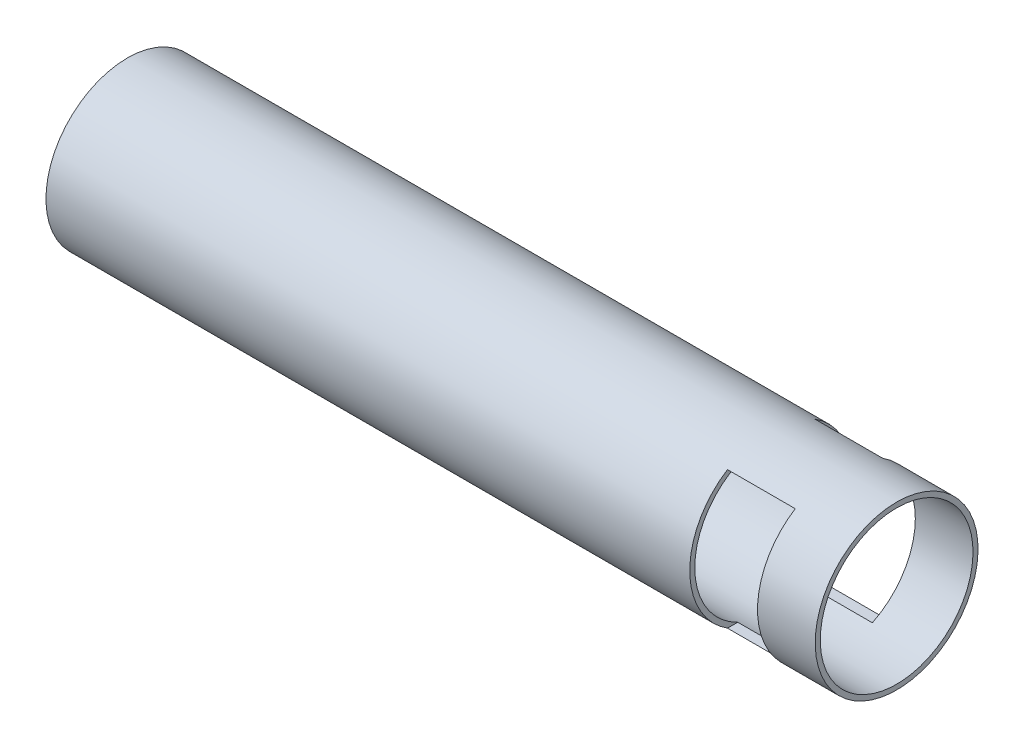
ISO-10303-21;
HEADER;
FILE_DESCRIPTION(('STEP AP214'),'2;1');
FILE_NAME('part.step','',(''),(''),'','','');
FILE_SCHEMA(('AUTOMOTIVE_DESIGN { 1 0 10303 214 1 1 1 1 }'));
ENDSEC;
DATA;
#1=APPLICATION_CONTEXT('core data for automotive mechanical design processes');
#2=APPLICATION_PROTOCOL_DEFINITION('international standard','automotive_design',2000,#1);
#3=PRODUCT_CONTEXT('',#1,'mechanical');
#4=PRODUCT('Part','Part','',(#3));
#5=PRODUCT_RELATED_PRODUCT_CATEGORY('part','',(#4));
#6=PRODUCT_DEFINITION_FORMATION('','',#4);
#7=PRODUCT_DEFINITION_CONTEXT('part definition',#1,'design');
#8=PRODUCT_DEFINITION('design','',#6,#7);
#9=PRODUCT_DEFINITION_SHAPE('','',#8);
#10=(LENGTH_UNIT() NAMED_UNIT(*) SI_UNIT(.MILLI.,.METRE.));
#11=(NAMED_UNIT(*) PLANE_ANGLE_UNIT() SI_UNIT($,.RADIAN.));
#12=(NAMED_UNIT(*) SI_UNIT($,.STERADIAN.) SOLID_ANGLE_UNIT());
#13=UNCERTAINTY_MEASURE_WITH_UNIT(LENGTH_MEASURE(1.E-05),#10,'distance_accuracy_value','');
#14=(GEOMETRIC_REPRESENTATION_CONTEXT(3) GLOBAL_UNCERTAINTY_ASSIGNED_CONTEXT((#13)) GLOBAL_UNIT_ASSIGNED_CONTEXT((#10,
#11,#12)) REPRESENTATION_CONTEXT('',''));
#15=CARTESIAN_POINT('',(0.,0.,0.));
#16=DIRECTION('',(0.,0.,1.));
#17=DIRECTION('',(1.,0.,0.));
#18=AXIS2_PLACEMENT_3D('',#15,#16,#17);
#19=CARTESIAN_POINT('',(210.,0.,0.));
#20=DIRECTION('',(-1.,0.,0.));
#21=DIRECTION('',(0.,-1.,0.));
#22=AXIS2_PLACEMENT_3D('',#19,#20,#21);
#23=CYLINDRICAL_SURFACE('',#22,41.7068);
#24=CARTESIAN_POINT('',(210.,0.,0.));
#25=DIRECTION('',(1.,0.,0.));
#26=DIRECTION('',(0.,1.,0.));
#27=AXIS2_PLACEMENT_3D('',#24,#25,#26);
#28=CIRCLE('',#27,41.7068);
#29=CARTESIAN_POINT('',(210.,41.7068000000001,0.));
#30=VERTEX_POINT('',#29);
#31=EDGE_CURVE('E150',#30,#30,#28,.T.);
#32=ORIENTED_EDGE('',*,*,#31,.T.);
#33=EDGE_LOOP('',(#32));
#34=FACE_BOUND('',#33,.T.);
#35=CARTESIAN_POINT('',(-210.,0.,0.));
#36=DIRECTION('',(1.,0.,0.));
#37=DIRECTION('',(0.,1.,0.));
#38=AXIS2_PLACEMENT_3D('',#35,#36,#37);
#39=CIRCLE('',#38,41.7068);
#40=CARTESIAN_POINT('',(-210.,41.7067999999999,0.));
#41=VERTEX_POINT('',#40);
#42=EDGE_CURVE('E158',#41,#41,#39,.T.);
#43=ORIENTED_EDGE('',*,*,#42,.F.);
#44=EDGE_LOOP('',(#43));
#45=FACE_BOUND('',#44,.T.);
#46=DIRECTION('',(-1.,0.,0.));
#47=VECTOR('',#46,1.);
#48=CARTESIAN_POINT('',(210.,-37.4999999999999,18.2539630283399));
#49=LINE('',#48,#47);
#50=CARTESIAN_POINT('',(141.5,-37.4999999999999,18.25396302834));
#51=VERTEX_POINT('',#50);
#52=CARTESIAN_POINT('',(178.5,-37.4999999999999,18.2539630283399));
#53=VERTEX_POINT('',#52);
#54=EDGE_CURVE('E114',#51,#53,#49,.F.);
#55=ORIENTED_EDGE('',*,*,#54,.T.);
#56=CARTESIAN_POINT('',(178.5,0.,0.));
#57=DIRECTION('',(-1.,0.,0.));
#58=DIRECTION('',(0.,0.,1.));
#59=AXIS2_PLACEMENT_3D('',#56,#57,#58);
#60=CIRCLE('',#59,41.7068);
#61=CARTESIAN_POINT('',(178.5,37.5000000000001,18.2539630283399));
#62=VERTEX_POINT('',#61);
#63=EDGE_CURVE('E147',#53,#62,#60,.T.);
#64=ORIENTED_EDGE('',*,*,#63,.T.);
#65=DIRECTION('',(-1.,0.,0.));
#66=VECTOR('',#65,1.);
#67=CARTESIAN_POINT('',(210.,37.5000000000001,18.2539630283399));
#68=LINE('',#67,#66);
#69=CARTESIAN_POINT('',(141.5,37.5000000000001,18.2539630283398));
#70=VERTEX_POINT('',#69);
#71=EDGE_CURVE('E137',#62,#70,#68,.T.);
#72=ORIENTED_EDGE('',*,*,#71,.T.);
#73=CARTESIAN_POINT('',(141.5,0.,0.));
#74=DIRECTION('',(1.,0.,0.));
#75=DIRECTION('',(0.,1.,0.));
#76=AXIS2_PLACEMENT_3D('',#73,#74,#75);
#77=CIRCLE('',#76,41.7068);
#78=EDGE_CURVE('E128',#70,#51,#77,.T.);
#79=ORIENTED_EDGE('',*,*,#78,.T.);
#80=EDGE_LOOP('',(#55,#64,#72,#79));
#81=FACE_BOUND('',#80,.T.);
#82=DIRECTION('',(-1.,0.,0.));
#83=VECTOR('',#82,1.);
#84=CARTESIAN_POINT('',(210.,37.5000000000001,-18.2539630283399));
#85=LINE('',#84,#83);
#86=CARTESIAN_POINT('',(141.5,37.5000000000001,-18.2539630283398));
#87=VERTEX_POINT('',#86);
#88=CARTESIAN_POINT('',(178.5,37.5000000000001,-18.2539630283399));
#89=VERTEX_POINT('',#88);
#90=EDGE_CURVE('E138',#87,#89,#85,.F.);
#91=ORIENTED_EDGE('',*,*,#90,.T.);
#92=CARTESIAN_POINT('',(178.5,-37.4999999999999,-18.2539630283399));
#93=VERTEX_POINT('',#92);
#94=EDGE_CURVE('E149',#89,#93,#60,.T.);
#95=ORIENTED_EDGE('',*,*,#94,.T.);
#96=DIRECTION('',(-1.,0.,0.));
#97=VECTOR('',#96,1.);
#98=CARTESIAN_POINT('',(210.,-37.4999999999999,-18.2539630283399));
#99=LINE('',#98,#97);
#100=CARTESIAN_POINT('',(141.5,-37.4999999999999,-18.2539630283399));
#101=VERTEX_POINT('',#100);
#102=EDGE_CURVE('E122',#93,#101,#99,.T.);
#103=ORIENTED_EDGE('',*,*,#102,.T.);
#104=EDGE_CURVE('E139',#101,#87,#77,.T.);
#105=ORIENTED_EDGE('',*,*,#104,.T.);
#106=EDGE_LOOP('',(#91,#95,#103,#105));
#107=FACE_BOUND('',#106,.T.);
#108=ADVANCED_FACE('F50',(#34,#45,#81,#107),#23,.F.);
#109=CARTESIAN_POINT('',(210.,0.,0.));
#110=DIRECTION('',(-1.,0.,0.));
#111=DIRECTION('',(0.,-1.,0.));
#112=AXIS2_PLACEMENT_3D('',#109,#110,#111);
#113=CYLINDRICAL_SURFACE('',#112,44.45);
#114=CARTESIAN_POINT('',(178.5,0.,0.));
#115=DIRECTION('',(-1.,0.,0.));
#116=DIRECTION('',(0.,0.,1.));
#117=AXIS2_PLACEMENT_3D('',#114,#115,#116);
#118=CIRCLE('',#117,44.45);
#119=CARTESIAN_POINT('',(178.5,-37.4999999999999,23.8652990762739));
#120=VERTEX_POINT('',#119);
#121=CARTESIAN_POINT('',(178.5,37.5000000000001,23.8652990762739));
#122=VERTEX_POINT('',#121);
#123=EDGE_CURVE('E59',#120,#122,#118,.T.);
#124=ORIENTED_EDGE('',*,*,#123,.F.);
#125=DIRECTION('',(-1.,0.,0.));
#126=VECTOR('',#125,1.);
#127=CARTESIAN_POINT('',(210.,-37.4999999999999,23.8652990762739));
#128=LINE('',#127,#126);
#129=CARTESIAN_POINT('',(141.5,-37.4999999999999,23.8652990762739));
#130=VERTEX_POINT('',#129);
#131=EDGE_CURVE('E157',#130,#120,#128,.F.);
#132=ORIENTED_EDGE('',*,*,#131,.F.);
#133=CARTESIAN_POINT('',(141.5,0.,0.));
#134=DIRECTION('',(1.,0.,0.));
#135=DIRECTION('',(0.,1.,0.));
#136=AXIS2_PLACEMENT_3D('',#133,#134,#135);
#137=CIRCLE('',#136,44.45);
#138=CARTESIAN_POINT('',(141.5,37.5000000000001,23.8652990762738));
#139=VERTEX_POINT('',#138);
#140=EDGE_CURVE('E131',#139,#130,#137,.T.);
#141=ORIENTED_EDGE('',*,*,#140,.F.);
#142=DIRECTION('',(-1.,0.,0.));
#143=VECTOR('',#142,1.);
#144=CARTESIAN_POINT('',(210.,37.5000000000001,23.8652990762739));
#145=LINE('',#144,#143);
#146=EDGE_CURVE('E165',#122,#139,#145,.T.);
#147=ORIENTED_EDGE('',*,*,#146,.F.);
#148=EDGE_LOOP('',(#124,#132,#141,#147));
#149=FACE_BOUND('',#148,.T.);
#150=CARTESIAN_POINT('',(210.,0.,0.));
#151=DIRECTION('',(1.,0.,0.));
#152=DIRECTION('',(0.,1.,0.));
#153=AXIS2_PLACEMENT_3D('',#150,#151,#152);
#154=CIRCLE('',#153,44.45);
#155=CARTESIAN_POINT('',(210.,44.4500000000001,0.));
#156=VERTEX_POINT('',#155);
#157=EDGE_CURVE('E153',#156,#156,#154,.T.);
#158=ORIENTED_EDGE('',*,*,#157,.F.);
#159=EDGE_LOOP('',(#158));
#160=FACE_BOUND('',#159,.T.);
#161=CARTESIAN_POINT('',(-210.,0.,0.));
#162=DIRECTION('',(1.,0.,0.));
#163=DIRECTION('',(0.,1.,0.));
#164=AXIS2_PLACEMENT_3D('',#161,#162,#163);
#165=CIRCLE('',#164,44.45);
#166=CARTESIAN_POINT('',(-210.,44.4499999999999,0.));
#167=VERTEX_POINT('',#166);
#168=EDGE_CURVE('E154',#167,#167,#165,.T.);
#169=ORIENTED_EDGE('',*,*,#168,.T.);
#170=EDGE_LOOP('',(#169));
#171=FACE_BOUND('',#170,.T.);
#172=CARTESIAN_POINT('',(178.5,37.5000000000001,-23.8652990762739));
#173=VERTEX_POINT('',#172);
#174=CARTESIAN_POINT('',(178.5,-37.4999999999999,-23.8652990762739));
#175=VERTEX_POINT('',#174);
#176=EDGE_CURVE('E12',#173,#175,#118,.T.);
#177=ORIENTED_EDGE('',*,*,#176,.F.);
#178=DIRECTION('',(-1.,0.,0.));
#179=VECTOR('',#178,1.);
#180=CARTESIAN_POINT('',(210.,37.5000000000001,-23.8652990762739));
#181=LINE('',#180,#179);
#182=CARTESIAN_POINT('',(141.5,37.5000000000001,-23.8652990762738));
#183=VERTEX_POINT('',#182);
#184=EDGE_CURVE('E53',#183,#173,#181,.F.);
#185=ORIENTED_EDGE('',*,*,#184,.F.);
#186=CARTESIAN_POINT('',(141.5,-37.4999999999999,-23.8652990762739));
#187=VERTEX_POINT('',#186);
#188=EDGE_CURVE('E166',#187,#183,#137,.T.);
#189=ORIENTED_EDGE('',*,*,#188,.F.);
#190=DIRECTION('',(-1.,0.,0.));
#191=VECTOR('',#190,1.);
#192=CARTESIAN_POINT('',(210.,-37.4999999999999,-23.8652990762739));
#193=LINE('',#192,#191);
#194=EDGE_CURVE('E167',#175,#187,#193,.T.);
#195=ORIENTED_EDGE('',*,*,#194,.F.);
#196=EDGE_LOOP('',(#177,#185,#189,#195));
#197=FACE_BOUND('',#196,.T.);
#198=ADVANCED_FACE('F187',(#149,#160,#171,#197),#113,.T.);
#199=CARTESIAN_POINT('',(210.,0.,0.));
#200=DIRECTION('',(1.,0.,0.));
#201=DIRECTION('',(0.,1.,0.));
#202=AXIS2_PLACEMENT_3D('',#199,#200,#201);
#203=PLANE('',#202);
#204=ORIENTED_EDGE('',*,*,#31,.F.);
#205=EDGE_LOOP('',(#204));
#206=FACE_BOUND('',#205,.T.);
#207=ORIENTED_EDGE('',*,*,#157,.T.);
#208=EDGE_LOOP('',(#207));
#209=FACE_BOUND('',#208,.T.);
#210=ADVANCED_FACE('F189',(#206,#209),#203,.T.);
#211=CARTESIAN_POINT('',(-210.,0.,0.));
#212=DIRECTION('',(1.,0.,0.));
#213=DIRECTION('',(0.,1.,0.));
#214=AXIS2_PLACEMENT_3D('',#211,#212,#213);
#215=PLANE('',#214);
#216=ORIENTED_EDGE('',*,*,#42,.T.);
#217=EDGE_LOOP('',(#216));
#218=FACE_BOUND('',#217,.T.);
#219=ORIENTED_EDGE('',*,*,#168,.F.);
#220=EDGE_LOOP('',(#219));
#221=FACE_BOUND('',#220,.T.);
#222=ADVANCED_FACE('F195',(#218,#221),#215,.F.);
#223=CARTESIAN_POINT('',(141.5,-37.4999999999999,50.));
#224=DIRECTION('',(0.,1.,0.));
#225=DIRECTION('',(0.,0.,1.));
#226=AXIS2_PLACEMENT_3D('',#223,#224,#225);
#227=PLANE('',#226);
#228=DIRECTION('',(0.,0.,-1.));
#229=VECTOR('',#228,1.);
#230=CARTESIAN_POINT('',(141.5,-37.4999999999999,50.));
#231=LINE('',#230,#229);
#232=EDGE_CURVE('E117',#130,#51,#231,.T.);
#233=ORIENTED_EDGE('',*,*,#232,.F.);
#234=ORIENTED_EDGE('',*,*,#131,.T.);
#235=DIRECTION('',(0.,0.,-1.));
#236=VECTOR('',#235,1.);
#237=CARTESIAN_POINT('',(178.5,-37.4999999999999,50.));
#238=LINE('',#237,#236);
#239=EDGE_CURVE('E74',#120,#53,#238,.T.);
#240=ORIENTED_EDGE('',*,*,#239,.T.);
#241=ORIENTED_EDGE('',*,*,#54,.F.);
#242=EDGE_LOOP('',(#233,#234,#240,#241));
#243=FACE_BOUND('',#242,.T.);
#244=ADVANCED_FACE('F116',(#243),#227,.T.);
#245=CARTESIAN_POINT('',(141.5,37.5000000000001,50.));
#246=DIRECTION('',(1.,0.,0.));
#247=DIRECTION('',(0.,1.,0.));
#248=AXIS2_PLACEMENT_3D('',#245,#246,#247);
#249=PLANE('',#248);
#250=DIRECTION('',(0.,0.,-1.));
#251=VECTOR('',#250,1.);
#252=CARTESIAN_POINT('',(141.5,37.5000000000001,50.));
#253=LINE('',#252,#251);
#254=EDGE_CURVE('E185',#139,#70,#253,.T.);
#255=ORIENTED_EDGE('',*,*,#254,.F.);
#256=ORIENTED_EDGE('',*,*,#140,.T.);
#257=ORIENTED_EDGE('',*,*,#232,.T.);
#258=ORIENTED_EDGE('',*,*,#78,.F.);
#259=EDGE_LOOP('',(#255,#256,#257,#258));
#260=FACE_BOUND('',#259,.T.);
#261=ADVANCED_FACE('F127',(#260),#249,.T.);
#262=CARTESIAN_POINT('',(141.5,37.5000000000001,50.));
#263=DIRECTION('',(0.,-1.,0.));
#264=DIRECTION('',(0.,0.,-1.));
#265=AXIS2_PLACEMENT_3D('',#262,#263,#264);
#266=PLANE('',#265);
#267=DIRECTION('',(0.,0.,-1.));
#268=VECTOR('',#267,1.);
#269=CARTESIAN_POINT('',(178.5,37.5000000000001,50.));
#270=LINE('',#269,#268);
#271=EDGE_CURVE('E123',#122,#62,#270,.T.);
#272=ORIENTED_EDGE('',*,*,#271,.F.);
#273=ORIENTED_EDGE('',*,*,#146,.T.);
#274=ORIENTED_EDGE('',*,*,#254,.T.);
#275=ORIENTED_EDGE('',*,*,#71,.F.);
#276=EDGE_LOOP('',(#272,#273,#274,#275));
#277=FACE_BOUND('',#276,.T.);
#278=ADVANCED_FACE('F208',(#277),#266,.T.);
#279=CARTESIAN_POINT('',(178.5,37.5000000000001,50.));
#280=DIRECTION('',(-1.,0.,0.));
#281=DIRECTION('',(0.,0.,1.));
#282=AXIS2_PLACEMENT_3D('',#279,#280,#281);
#283=PLANE('',#282);
#284=ORIENTED_EDGE('',*,*,#239,.F.);
#285=ORIENTED_EDGE('',*,*,#123,.T.);
#286=ORIENTED_EDGE('',*,*,#271,.T.);
#287=ORIENTED_EDGE('',*,*,#63,.F.);
#288=EDGE_LOOP('',(#284,#285,#286,#287));
#289=FACE_BOUND('',#288,.T.);
#290=ADVANCED_FACE('F207',(#289),#283,.T.);
#291=EDGE_CURVE('E178',#89,#173,#270,.T.);
#292=ORIENTED_EDGE('',*,*,#291,.T.);
#293=ORIENTED_EDGE('',*,*,#176,.T.);
#294=EDGE_CURVE('E326',#93,#175,#238,.T.);
#295=ORIENTED_EDGE('',*,*,#294,.F.);
#296=ORIENTED_EDGE('',*,*,#94,.F.);
#297=EDGE_LOOP('',(#292,#293,#295,#296));
#298=FACE_BOUND('',#297,.T.);
#299=ADVANCED_FACE('F182',(#298),#283,.T.);
#300=EDGE_CURVE('E133',#87,#183,#253,.T.);
#301=ORIENTED_EDGE('',*,*,#300,.T.);
#302=ORIENTED_EDGE('',*,*,#184,.T.);
#303=ORIENTED_EDGE('',*,*,#291,.F.);
#304=ORIENTED_EDGE('',*,*,#90,.F.);
#305=EDGE_LOOP('',(#301,#302,#303,#304));
#306=FACE_BOUND('',#305,.T.);
#307=ADVANCED_FACE('F177',(#306),#266,.T.);
#308=EDGE_CURVE('E66',#101,#187,#231,.T.);
#309=ORIENTED_EDGE('',*,*,#308,.T.);
#310=ORIENTED_EDGE('',*,*,#188,.T.);
#311=ORIENTED_EDGE('',*,*,#300,.F.);
#312=ORIENTED_EDGE('',*,*,#104,.F.);
#313=EDGE_LOOP('',(#309,#310,#311,#312));
#314=FACE_BOUND('',#313,.T.);
#315=ADVANCED_FACE('F214',(#314),#249,.T.);
#316=ORIENTED_EDGE('',*,*,#294,.T.);
#317=ORIENTED_EDGE('',*,*,#194,.T.);
#318=ORIENTED_EDGE('',*,*,#308,.F.);
#319=ORIENTED_EDGE('',*,*,#102,.F.);
#320=EDGE_LOOP('',(#316,#317,#318,#319));
#321=FACE_BOUND('',#320,.T.);
#322=ADVANCED_FACE('F215',(#321),#227,.T.);
#323=CLOSED_SHELL('',(#108,#198,#210,#222,#244,#261,#278,#290,#299,#307,#315,#322));
#324=MANIFOLD_SOLID_BREP('B2',#323);
#325=ADVANCED_BREP_SHAPE_REPRESENTATION('',(#18,#324),#14);
#326=SHAPE_DEFINITION_REPRESENTATION(#9,#325);
ENDSEC;
END-ISO-10303-21;
